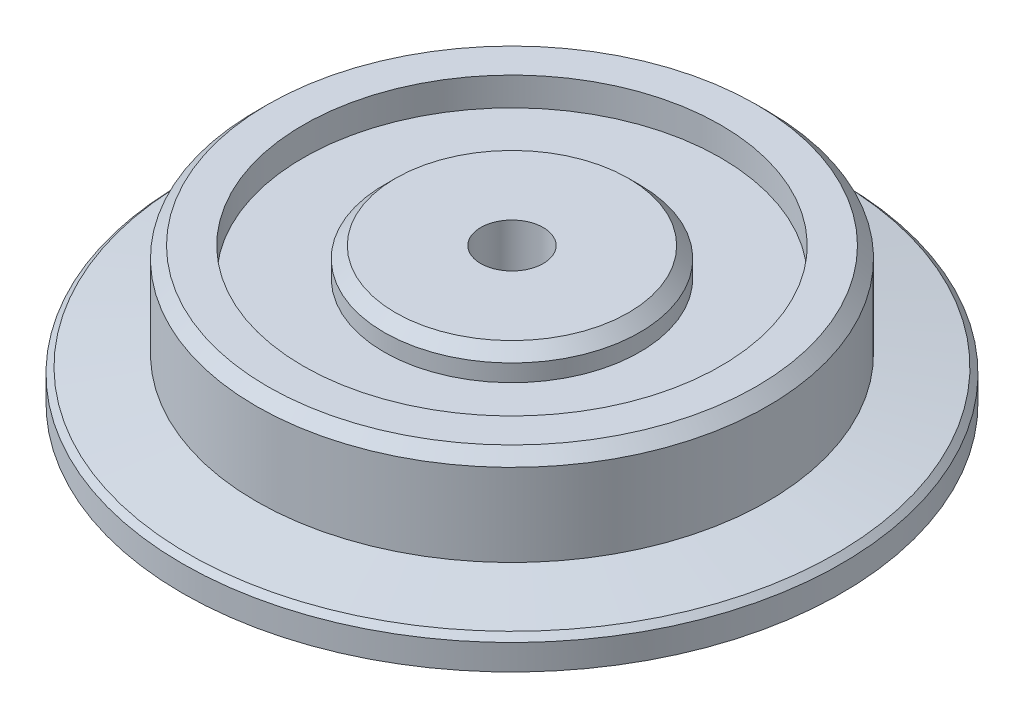
ISO-10303-21;
HEADER;
FILE_DESCRIPTION(('STEP AP214'),'2;1');
FILE_NAME('part.step','',(''),(''),'','','');
FILE_SCHEMA(('AUTOMOTIVE_DESIGN { 1 0 10303 214 1 1 1 1 }'));
ENDSEC;
DATA;
#1=APPLICATION_CONTEXT('core data for automotive mechanical design processes');
#2=APPLICATION_PROTOCOL_DEFINITION('international standard','automotive_design',2000,#1);
#3=PRODUCT_CONTEXT('',#1,'mechanical');
#4=PRODUCT('Part','Part','',(#3));
#5=PRODUCT_RELATED_PRODUCT_CATEGORY('part','',(#4));
#6=PRODUCT_DEFINITION_FORMATION('','',#4);
#7=PRODUCT_DEFINITION_CONTEXT('part definition',#1,'design');
#8=PRODUCT_DEFINITION('design','',#6,#7);
#9=PRODUCT_DEFINITION_SHAPE('','',#8);
#10=(LENGTH_UNIT() NAMED_UNIT(*) SI_UNIT(.MILLI.,.METRE.));
#11=(NAMED_UNIT(*) PLANE_ANGLE_UNIT() SI_UNIT($,.RADIAN.));
#12=(NAMED_UNIT(*) SI_UNIT($,.STERADIAN.) SOLID_ANGLE_UNIT());
#13=UNCERTAINTY_MEASURE_WITH_UNIT(LENGTH_MEASURE(1.E-05),#10,'distance_accuracy_value','');
#14=(GEOMETRIC_REPRESENTATION_CONTEXT(3) GLOBAL_UNCERTAINTY_ASSIGNED_CONTEXT((#13)) GLOBAL_UNIT_ASSIGNED_CONTEXT((#10,
#11,#12)) REPRESENTATION_CONTEXT('',''));
#15=CARTESIAN_POINT('',(0.,0.,0.));
#16=DIRECTION('',(0.,0.,1.));
#17=DIRECTION('',(1.,0.,0.));
#18=AXIS2_PLACEMENT_3D('',#15,#16,#17);
#19=CARTESIAN_POINT('',(0.,0.,0.));
#20=DIRECTION('',(0.,1.,0.));
#21=DIRECTION('',(0.,0.,1.));
#22=AXIS2_PLACEMENT_3D('',#19,#20,#21);
#23=PLANE('',#22);
#24=CARTESIAN_POINT('',(0.,0.,0.));
#25=DIRECTION('',(0.,1.,0.));
#26=DIRECTION('',(0.,0.,1.));
#27=AXIS2_PLACEMENT_3D('',#24,#25,#26);
#28=CIRCLE('',#27,1.6);
#29=CARTESIAN_POINT('',(0.,0.,1.6));
#30=VERTEX_POINT('',#29);
#31=EDGE_CURVE('E61',#30,#30,#28,.T.);
#32=ORIENTED_EDGE('',*,*,#31,.T.);
#33=EDGE_LOOP('',(#32));
#34=FACE_BOUND('',#33,.T.);
#35=CARTESIAN_POINT('',(0.,0.,0.));
#36=DIRECTION('',(0.,1.,0.));
#37=DIRECTION('',(0.,0.,1.));
#38=AXIS2_PLACEMENT_3D('',#35,#36,#37);
#39=CIRCLE('',#38,11.6);
#40=CARTESIAN_POINT('',(0.,0.,11.6));
#41=VERTEX_POINT('',#40);
#42=EDGE_CURVE('E86',#41,#41,#39,.T.);
#43=ORIENTED_EDGE('',*,*,#42,.F.);
#44=EDGE_LOOP('',(#43));
#45=FACE_BOUND('',#44,.T.);
#46=ADVANCED_FACE('F53',(#34,#45),#23,.F.);
#47=CARTESIAN_POINT('',(0.,1.1,0.));
#48=DIRECTION('',(0.,-1.,0.));
#49=DIRECTION('',(0.,0.,-1.));
#50=AXIS2_PLACEMENT_3D('',#47,#48,#49);
#51=CYLINDRICAL_SURFACE('',#50,11.6);
#52=CARTESIAN_POINT('',(0.,0.900000000000005,0.));
#53=DIRECTION('',(0.,1.,0.));
#54=DIRECTION('',(0.,0.,1.));
#55=AXIS2_PLACEMENT_3D('',#52,#53,#54);
#56=CIRCLE('',#55,11.6);
#57=CARTESIAN_POINT('',(0.,0.900000000000005,11.6));
#58=VERTEX_POINT('',#57);
#59=EDGE_CURVE('E80',#58,#58,#56,.F.);
#60=ORIENTED_EDGE('',*,*,#59,.T.);
#61=EDGE_LOOP('',(#60));
#62=FACE_BOUND('',#61,.T.);
#63=ORIENTED_EDGE('',*,*,#42,.T.);
#64=EDGE_LOOP('',(#63));
#65=FACE_BOUND('',#64,.T.);
#66=ADVANCED_FACE('F142',(#62,#65),#51,.T.);
#67=CARTESIAN_POINT('',(0.,1.1,0.));
#68=DIRECTION('',(0.,-1.,0.));
#69=DIRECTION('',(0.,0.,-1.));
#70=AXIS2_PLACEMENT_3D('',#67,#68,#69);
#71=CYLINDRICAL_SURFACE('',#70,1.1);
#72=CARTESIAN_POINT('',(0.,0.500000000000004,0.));
#73=DIRECTION('',(0.,1.,0.));
#74=DIRECTION('',(0.,0.,1.));
#75=AXIS2_PLACEMENT_3D('',#72,#73,#74);
#76=CIRCLE('',#75,1.1);
#77=CARTESIAN_POINT('',(0.,0.500000000000004,1.1));
#78=VERTEX_POINT('',#77);
#79=EDGE_CURVE('E11',#78,#78,#76,.F.);
#80=ORIENTED_EDGE('',*,*,#79,.T.);
#81=EDGE_LOOP('',(#80));
#82=FACE_BOUND('',#81,.T.);
#83=CARTESIAN_POINT('',(0.,4.8,0.));
#84=DIRECTION('',(0.,1.,0.));
#85=DIRECTION('',(0.,0.,1.));
#86=AXIS2_PLACEMENT_3D('',#83,#84,#85);
#87=CIRCLE('',#86,1.1);
#88=CARTESIAN_POINT('',(0.,4.8,1.1));
#89=VERTEX_POINT('',#88);
#90=EDGE_CURVE('E94',#89,#89,#87,.T.);
#91=ORIENTED_EDGE('',*,*,#90,.T.);
#92=EDGE_LOOP('',(#91));
#93=FACE_BOUND('',#92,.T.);
#94=ADVANCED_FACE('F147',(#82,#93),#71,.F.);
#95=CARTESIAN_POINT('',(0.,1.1,0.));
#96=DIRECTION('',(0.,-1.,0.));
#97=DIRECTION('',(0.,0.,-1.));
#98=AXIS2_PLACEMENT_3D('',#95,#96,#97);
#99=CONICAL_SURFACE('',#98,11.4,0.785398163397461);
#100=ORIENTED_EDGE('',*,*,#59,.F.);
#101=EDGE_LOOP('',(#100));
#102=FACE_BOUND('',#101,.T.);
#103=CARTESIAN_POINT('',(0.,1.1,0.));
#104=DIRECTION('',(0.,-1.,0.));
#105=DIRECTION('',(0.,0.,-1.));
#106=AXIS2_PLACEMENT_3D('',#103,#104,#105);
#107=CIRCLE('',#106,11.4);
#108=CARTESIAN_POINT('',(0.,1.1,-11.4));
#109=VERTEX_POINT('',#108);
#110=EDGE_CURVE('E83',#109,#109,#107,.F.);
#111=ORIENTED_EDGE('',*,*,#110,.F.);
#112=EDGE_LOOP('',(#111));
#113=FACE_BOUND('',#112,.T.);
#114=ADVANCED_FACE('F134',(#102,#113),#99,.T.);
#115=CARTESIAN_POINT('',(0.,1.5,0.));
#116=DIRECTION('',(0.,-1.,0.));
#117=DIRECTION('',(0.,0.,-1.));
#118=AXIS2_PLACEMENT_3D('',#115,#116,#117);
#119=CONICAL_SURFACE('',#118,9.,1.40564764938027);
#120=CARTESIAN_POINT('',(0.,1.5,0.));
#121=DIRECTION('',(0.,1.,0.));
#122=DIRECTION('',(0.,0.,1.));
#123=AXIS2_PLACEMENT_3D('',#120,#121,#122);
#124=CIRCLE('',#123,9.);
#125=CARTESIAN_POINT('',(0.,1.5,9.));
#126=VERTEX_POINT('',#125);
#127=EDGE_CURVE('E91',#126,#126,#124,.T.);
#128=ORIENTED_EDGE('',*,*,#127,.F.);
#129=EDGE_LOOP('',(#128));
#130=FACE_BOUND('',#129,.T.);
#131=ORIENTED_EDGE('',*,*,#110,.T.);
#132=EDGE_LOOP('',(#131));
#133=FACE_BOUND('',#132,.T.);
#134=ADVANCED_FACE('F125',(#130,#133),#119,.T.);
#135=CARTESIAN_POINT('',(0.,4.8,0.));
#136=DIRECTION('',(0.,1.,0.));
#137=DIRECTION('',(0.,0.,1.));
#138=AXIS2_PLACEMENT_3D('',#135,#136,#137);
#139=PLANE('',#138);
#140=CARTESIAN_POINT('',(0.,4.8,0.));
#141=DIRECTION('',(0.,1.,0.));
#142=DIRECTION('',(0.,0.,1.));
#143=AXIS2_PLACEMENT_3D('',#140,#141,#142);
#144=CIRCLE('',#143,8.60000000000001);
#145=CARTESIAN_POINT('',(0.,4.8,8.60000000000001));
#146=VERTEX_POINT('',#145);
#147=EDGE_CURVE('E69',#146,#146,#144,.T.);
#148=ORIENTED_EDGE('',*,*,#147,.T.);
#149=EDGE_LOOP('',(#148));
#150=FACE_BOUND('',#149,.T.);
#151=CARTESIAN_POINT('',(0.,4.8,0.));
#152=DIRECTION('',(0.,1.,0.));
#153=DIRECTION('',(0.,0.,1.));
#154=AXIS2_PLACEMENT_3D('',#151,#152,#153);
#155=CIRCLE('',#154,7.35);
#156=CARTESIAN_POINT('',(0.,4.8,7.35));
#157=VERTEX_POINT('',#156);
#158=EDGE_CURVE('E98',#157,#157,#155,.T.);
#159=ORIENTED_EDGE('',*,*,#158,.F.);
#160=EDGE_LOOP('',(#159));
#161=FACE_BOUND('',#160,.T.);
#162=ADVANCED_FACE('F122',(#150,#161),#139,.T.);
#163=CARTESIAN_POINT('',(0.,4.8,0.));
#164=DIRECTION('',(0.,-1.,0.));
#165=DIRECTION('',(0.,0.,-1.));
#166=AXIS2_PLACEMENT_3D('',#163,#164,#165);
#167=CYLINDRICAL_SURFACE('',#166,9.);
#168=CARTESIAN_POINT('',(0.,4.4,0.));
#169=DIRECTION('',(0.,1.,0.));
#170=DIRECTION('',(0.,0.,1.));
#171=AXIS2_PLACEMENT_3D('',#168,#169,#170);
#172=CIRCLE('',#171,9.);
#173=CARTESIAN_POINT('',(0.,4.4,9.));
#174=VERTEX_POINT('',#173);
#175=EDGE_CURVE('E65',#174,#174,#172,.F.);
#176=ORIENTED_EDGE('',*,*,#175,.T.);
#177=EDGE_LOOP('',(#176));
#178=FACE_BOUND('',#177,.T.);
#179=ORIENTED_EDGE('',*,*,#127,.T.);
#180=EDGE_LOOP('',(#179));
#181=FACE_BOUND('',#180,.T.);
#182=ADVANCED_FACE('F124',(#178,#181),#167,.T.);
#183=CARTESIAN_POINT('',(0.,3.8,0.));
#184=DIRECTION('',(0.,1.,0.));
#185=DIRECTION('',(0.,0.,1.));
#186=AXIS2_PLACEMENT_3D('',#183,#184,#185);
#187=CYLINDRICAL_SURFACE('',#186,4.5);
#188=CARTESIAN_POINT('',(0.,4.40000000000001,0.));
#189=DIRECTION('',(0.,1.,0.));
#190=DIRECTION('',(0.,0.,1.));
#191=AXIS2_PLACEMENT_3D('',#188,#189,#190);
#192=CIRCLE('',#191,4.5);
#193=CARTESIAN_POINT('',(0.,4.40000000000001,4.5));
#194=VERTEX_POINT('',#193);
#195=EDGE_CURVE('E74',#194,#194,#192,.F.);
#196=ORIENTED_EDGE('',*,*,#195,.T.);
#197=EDGE_LOOP('',(#196));
#198=FACE_BOUND('',#197,.T.);
#199=CARTESIAN_POINT('',(0.,3.8,0.));
#200=DIRECTION('',(0.,1.,0.));
#201=DIRECTION('',(0.,0.,1.));
#202=AXIS2_PLACEMENT_3D('',#199,#200,#201);
#203=CIRCLE('',#202,4.5);
#204=CARTESIAN_POINT('',(0.,3.8,4.5));
#205=VERTEX_POINT('',#204);
#206=EDGE_CURVE('E101',#205,#205,#203,.T.);
#207=ORIENTED_EDGE('',*,*,#206,.T.);
#208=EDGE_LOOP('',(#207));
#209=FACE_BOUND('',#208,.T.);
#210=ADVANCED_FACE('F107',(#198,#209),#187,.T.);
#211=CARTESIAN_POINT('',(0.,3.8,0.));
#212=DIRECTION('',(0.,1.,0.));
#213=DIRECTION('',(0.,0.,1.));
#214=AXIS2_PLACEMENT_3D('',#211,#212,#213);
#215=CYLINDRICAL_SURFACE('',#214,7.35);
#216=CARTESIAN_POINT('',(0.,3.8,0.));
#217=DIRECTION('',(0.,1.,0.));
#218=DIRECTION('',(0.,0.,1.));
#219=AXIS2_PLACEMENT_3D('',#216,#217,#218);
#220=CIRCLE('',#219,7.35);
#221=CARTESIAN_POINT('',(0.,3.8,7.35));
#222=VERTEX_POINT('',#221);
#223=EDGE_CURVE('E97',#222,#222,#220,.T.);
#224=ORIENTED_EDGE('',*,*,#223,.F.);
#225=EDGE_LOOP('',(#224));
#226=FACE_BOUND('',#225,.T.);
#227=ORIENTED_EDGE('',*,*,#158,.T.);
#228=EDGE_LOOP('',(#227));
#229=FACE_BOUND('',#228,.T.);
#230=ADVANCED_FACE('F113',(#226,#229),#215,.F.);
#231=CARTESIAN_POINT('',(0.,3.8,0.));
#232=DIRECTION('',(0.,1.,0.));
#233=DIRECTION('',(0.,0.,1.));
#234=AXIS2_PLACEMENT_3D('',#231,#232,#233);
#235=PLANE('',#234);
#236=ORIENTED_EDGE('',*,*,#206,.F.);
#237=EDGE_LOOP('',(#236));
#238=FACE_BOUND('',#237,.T.);
#239=ORIENTED_EDGE('',*,*,#223,.T.);
#240=EDGE_LOOP('',(#239));
#241=FACE_BOUND('',#240,.T.);
#242=ADVANCED_FACE('F109',(#238,#241),#235,.T.);
#243=CARTESIAN_POINT('',(0.,4.8,0.));
#244=DIRECTION('',(0.,1.,0.));
#245=DIRECTION('',(0.,0.,1.));
#246=AXIS2_PLACEMENT_3D('',#243,#244,#245);
#247=CIRCLE('',#246,4.10000000000001);
#248=CARTESIAN_POINT('',(0.,4.8,4.10000000000001));
#249=VERTEX_POINT('',#248);
#250=EDGE_CURVE('E77',#249,#249,#247,.T.);
#251=ORIENTED_EDGE('',*,*,#250,.T.);
#252=EDGE_LOOP('',(#251));
#253=FACE_BOUND('',#252,.T.);
#254=ORIENTED_EDGE('',*,*,#90,.F.);
#255=EDGE_LOOP('',(#254));
#256=FACE_BOUND('',#255,.T.);
#257=ADVANCED_FACE('F112',(#253,#256),#139,.T.);
#258=CARTESIAN_POINT('',(0.,4.8,0.));
#259=DIRECTION('',(0.,-1.,0.));
#260=DIRECTION('',(0.,0.,-1.));
#261=AXIS2_PLACEMENT_3D('',#258,#259,#260);
#262=CONICAL_SURFACE('',#261,4.10000000000001,0.785398163397444);
#263=ORIENTED_EDGE('',*,*,#195,.F.);
#264=EDGE_LOOP('',(#263));
#265=FACE_BOUND('',#264,.T.);
#266=ORIENTED_EDGE('',*,*,#250,.F.);
#267=EDGE_LOOP('',(#266));
#268=FACE_BOUND('',#267,.T.);
#269=ADVANCED_FACE('F139',(#265,#268),#262,.T.);
#270=CARTESIAN_POINT('',(0.,4.8,0.));
#271=DIRECTION('',(0.,-1.,0.));
#272=DIRECTION('',(0.,0.,-1.));
#273=AXIS2_PLACEMENT_3D('',#270,#271,#272);
#274=CONICAL_SURFACE('',#273,8.60000000000001,0.785398163397444);
#275=ORIENTED_EDGE('',*,*,#175,.F.);
#276=EDGE_LOOP('',(#275));
#277=FACE_BOUND('',#276,.T.);
#278=ORIENTED_EDGE('',*,*,#147,.F.);
#279=EDGE_LOOP('',(#278));
#280=FACE_BOUND('',#279,.T.);
#281=ADVANCED_FACE('F164',(#277,#280),#274,.T.);
#282=CARTESIAN_POINT('',(0.,0.,0.));
#283=DIRECTION('',(0.,-1.,0.));
#284=DIRECTION('',(0.,0.,-1.));
#285=AXIS2_PLACEMENT_3D('',#282,#283,#284);
#286=CONICAL_SURFACE('',#285,1.6,0.785398163397445);
#287=ORIENTED_EDGE('',*,*,#79,.F.);
#288=EDGE_LOOP('',(#287));
#289=FACE_BOUND('',#288,.T.);
#290=ORIENTED_EDGE('',*,*,#31,.F.);
#291=EDGE_LOOP('',(#290));
#292=FACE_BOUND('',#291,.T.);
#293=ADVANCED_FACE('F56',(#289,#292),#286,.F.);
#294=CLOSED_SHELL('',(#46,#66,#94,#114,#134,#162,#182,#210,#230,#242,#257,#269,#281,#293));
#295=MANIFOLD_SOLID_BREP('B2',#294);
#296=ADVANCED_BREP_SHAPE_REPRESENTATION('',(#18,#295),#14);
#297=SHAPE_DEFINITION_REPRESENTATION(#9,#296);
ENDSEC;
END-ISO-10303-21;
